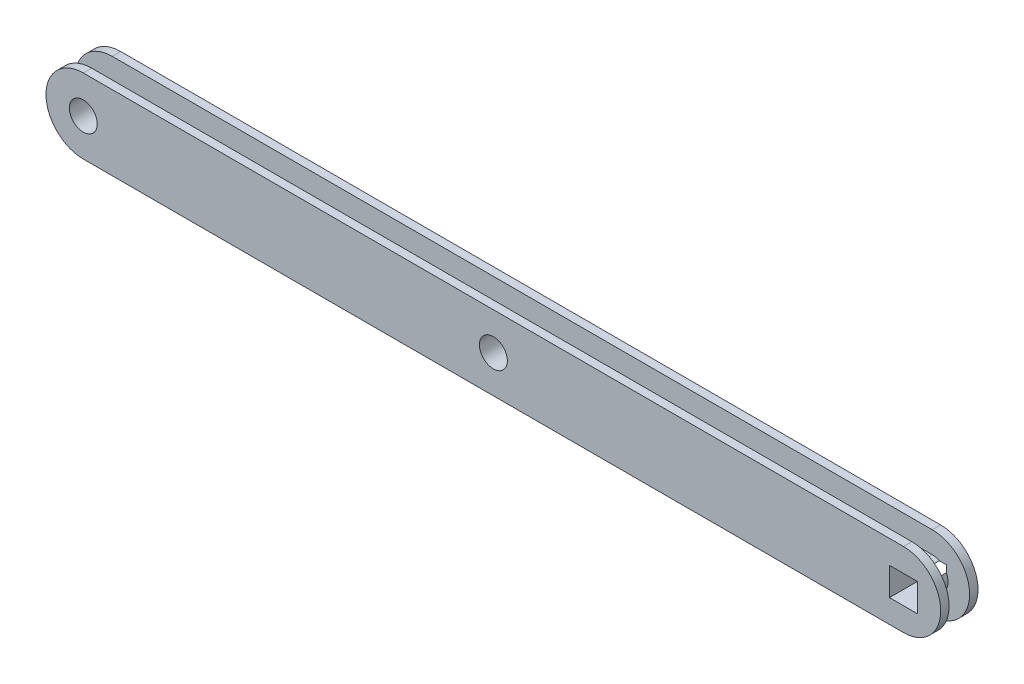
ISO-10303-21;
HEADER;
FILE_DESCRIPTION(('STEP AP214'),'2;1');
FILE_NAME('part.step','',(''),(''),'','','');
FILE_SCHEMA(('AUTOMOTIVE_DESIGN { 1 0 10303 214 1 1 1 1 }'));
ENDSEC;
DATA;
#1=APPLICATION_CONTEXT('core data for automotive mechanical design processes');
#2=APPLICATION_PROTOCOL_DEFINITION('international standard','automotive_design',2000,#1);
#3=PRODUCT_CONTEXT('',#1,'mechanical');
#4=PRODUCT('Part','Part','',(#3));
#5=PRODUCT_RELATED_PRODUCT_CATEGORY('part','',(#4));
#6=PRODUCT_DEFINITION_FORMATION('','',#4);
#7=PRODUCT_DEFINITION_CONTEXT('part definition',#1,'design');
#8=PRODUCT_DEFINITION('design','',#6,#7);
#9=PRODUCT_DEFINITION_SHAPE('','',#8);
#10=(LENGTH_UNIT() NAMED_UNIT(*) SI_UNIT(.MILLI.,.METRE.));
#11=(NAMED_UNIT(*) PLANE_ANGLE_UNIT() SI_UNIT($,.RADIAN.));
#12=(NAMED_UNIT(*) SI_UNIT($,.STERADIAN.) SOLID_ANGLE_UNIT());
#13=UNCERTAINTY_MEASURE_WITH_UNIT(LENGTH_MEASURE(1.E-05),#10,'distance_accuracy_value','');
#14=(GEOMETRIC_REPRESENTATION_CONTEXT(3) GLOBAL_UNCERTAINTY_ASSIGNED_CONTEXT((#13)) GLOBAL_UNIT_ASSIGNED_CONTEXT((#10,
#11,#12)) REPRESENTATION_CONTEXT('',''));
#15=CARTESIAN_POINT('',(0.,0.,0.));
#16=DIRECTION('',(0.,0.,1.));
#17=DIRECTION('',(1.,0.,0.));
#18=AXIS2_PLACEMENT_3D('',#15,#16,#17);
#19=CARTESIAN_POINT('',(0.,0.,-6.35));
#20=DIRECTION('',(0.,-1.,0.));
#21=DIRECTION('',(1.,0.,0.));
#22=AXIS2_PLACEMENT_3D('',#19,#20,#21);
#23=PLANE('',#22);
#24=DIRECTION('',(0.,0.,1.));
#25=VECTOR('',#24,1.);
#26=CARTESIAN_POINT('',(-146.05,0.,-6.35));
#27=LINE('',#26,#25);
#28=CARTESIAN_POINT('',(-146.05,0.,-1.427499939));
#29=VERTEX_POINT('',#28);
#30=CARTESIAN_POINT('',(-146.05,0.,0.));
#31=VERTEX_POINT('',#30);
#32=EDGE_CURVE('E320',#29,#31,#27,.T.);
#33=ORIENTED_EDGE('',*,*,#32,.F.);
#34=DIRECTION('',(1.,0.,0.));
#35=VECTOR('',#34,1.);
#36=CARTESIAN_POINT('',(-152.4,0.,-1.427499939));
#37=LINE('',#36,#35);
#38=CARTESIAN_POINT('',(-6.35000000000005,0.,-1.427499939));
#39=VERTEX_POINT('',#38);
#40=EDGE_CURVE('E304',#29,#39,#37,.T.);
#41=ORIENTED_EDGE('',*,*,#40,.T.);
#42=DIRECTION('',(0.,0.,1.));
#43=VECTOR('',#42,1.);
#44=CARTESIAN_POINT('',(-6.34999999999999,0.,-6.35));
#45=LINE('',#44,#43);
#46=CARTESIAN_POINT('',(-6.34999999999999,0.,0.));
#47=VERTEX_POINT('',#46);
#48=EDGE_CURVE('E446',#39,#47,#45,.T.);
#49=ORIENTED_EDGE('',*,*,#48,.T.);
#50=DIRECTION('',(1.,0.,0.));
#51=VECTOR('',#50,1.);
#52=CARTESIAN_POINT('',(0.,0.,0.));
#53=LINE('',#52,#51);
#54=EDGE_CURVE('E386',#31,#47,#53,.T.);
#55=ORIENTED_EDGE('',*,*,#54,.F.);
#56=EDGE_LOOP('',(#33,#41,#49,#55));
#57=FACE_BOUND('',#56,.T.);
#58=ADVANCED_FACE('F143',(#57),#23,.T.);
#59=CARTESIAN_POINT('',(-6.34999999999999,0.,-6.35));
#60=VERTEX_POINT('',#59);
#61=CARTESIAN_POINT('',(-6.35000000000005,0.,-4.922500061));
#62=VERTEX_POINT('',#61);
#63=EDGE_CURVE('E300',#60,#62,#45,.T.);
#64=ORIENTED_EDGE('',*,*,#63,.T.);
#65=DIRECTION('',(1.,0.,0.));
#66=VECTOR('',#65,1.);
#67=CARTESIAN_POINT('',(-152.4,0.,-4.922500061));
#68=LINE('',#67,#66);
#69=CARTESIAN_POINT('',(-146.05,0.,-4.922500061));
#70=VERTEX_POINT('',#69);
#71=EDGE_CURVE('E292',#70,#62,#68,.T.);
#72=ORIENTED_EDGE('',*,*,#71,.F.);
#73=CARTESIAN_POINT('',(-146.05,0.,-6.35));
#74=VERTEX_POINT('',#73);
#75=EDGE_CURVE('E297',#74,#70,#27,.T.);
#76=ORIENTED_EDGE('',*,*,#75,.F.);
#77=DIRECTION('',(1.,0.,0.));
#78=VECTOR('',#77,1.);
#79=CARTESIAN_POINT('',(0.,0.,-6.35));
#80=LINE('',#79,#78);
#81=EDGE_CURVE('E385',#74,#60,#80,.T.);
#82=ORIENTED_EDGE('',*,*,#81,.T.);
#83=EDGE_LOOP('',(#64,#72,#76,#82));
#84=FACE_BOUND('',#83,.T.);
#85=ADVANCED_FACE('F294',(#84),#23,.T.);
#86=CARTESIAN_POINT('',(-152.4,12.7,-6.35));
#87=DIRECTION('',(0.,1.,0.));
#88=DIRECTION('',(-1.,0.,0.));
#89=AXIS2_PLACEMENT_3D('',#86,#87,#88);
#90=PLANE('',#89);
#91=DIRECTION('',(1.,0.,0.));
#92=VECTOR('',#91,1.);
#93=CARTESIAN_POINT('',(-152.4,12.7,-1.427499939));
#94=LINE('',#93,#92);
#95=CARTESIAN_POINT('',(-146.05,12.7,-1.427499939));
#96=VERTEX_POINT('',#95);
#97=CARTESIAN_POINT('',(-6.35000000000008,12.7,-1.427499939));
#98=VERTEX_POINT('',#97);
#99=EDGE_CURVE('E468',#96,#98,#94,.T.);
#100=ORIENTED_EDGE('',*,*,#99,.F.);
#101=DIRECTION('',(0.,0.,1.));
#102=VECTOR('',#101,1.);
#103=CARTESIAN_POINT('',(-146.05,12.7,-6.35));
#104=LINE('',#103,#102);
#105=CARTESIAN_POINT('',(-146.05,12.7,0.));
#106=VERTEX_POINT('',#105);
#107=EDGE_CURVE('E444',#96,#106,#104,.T.);
#108=ORIENTED_EDGE('',*,*,#107,.T.);
#109=DIRECTION('',(-1.,0.,0.));
#110=VECTOR('',#109,1.);
#111=CARTESIAN_POINT('',(-152.4,12.7,0.));
#112=LINE('',#111,#110);
#113=CARTESIAN_POINT('',(-6.35,12.7,0.));
#114=VERTEX_POINT('',#113);
#115=EDGE_CURVE('E367',#114,#106,#112,.T.);
#116=ORIENTED_EDGE('',*,*,#115,.F.);
#117=DIRECTION('',(0.,0.,1.));
#118=VECTOR('',#117,1.);
#119=CARTESIAN_POINT('',(-6.35,12.7,-6.35));
#120=LINE('',#119,#118);
#121=EDGE_CURVE('E378',#98,#114,#120,.T.);
#122=ORIENTED_EDGE('',*,*,#121,.F.);
#123=EDGE_LOOP('',(#100,#108,#116,#122));
#124=FACE_BOUND('',#123,.T.);
#125=ADVANCED_FACE('F467',(#124),#90,.T.);
#126=CARTESIAN_POINT('',(-6.35,6.34999999999998,-6.35));
#127=DIRECTION('',(0.,0.,1.));
#128=DIRECTION('',(1.,0.,0.));
#129=AXIS2_PLACEMENT_3D('',#126,#127,#128);
#130=CYLINDRICAL_SURFACE('',#129,6.35);
#131=CARTESIAN_POINT('',(-6.35,6.34999999999998,-4.922500061));
#132=DIRECTION('',(0.,0.,1.));
#133=DIRECTION('',(1.,0.,0.));
#134=AXIS2_PLACEMENT_3D('',#131,#132,#133);
#135=CIRCLE('',#134,6.35);
#136=CARTESIAN_POINT('',(-6.35000000000008,12.7,-4.922500061));
#137=VERTEX_POINT('',#136);
#138=EDGE_CURVE('E427',#62,#137,#135,.T.);
#139=ORIENTED_EDGE('',*,*,#138,.F.);
#140=ORIENTED_EDGE('',*,*,#63,.F.);
#141=CARTESIAN_POINT('',(-6.35,6.34999999999998,-6.35));
#142=DIRECTION('',(0.,0.,1.));
#143=DIRECTION('',(1.,0.,0.));
#144=AXIS2_PLACEMENT_3D('',#141,#142,#143);
#145=CIRCLE('',#144,6.35);
#146=CARTESIAN_POINT('',(-6.35,12.7,-6.35));
#147=VERTEX_POINT('',#146);
#148=EDGE_CURVE('E323',#147,#60,#145,.F.);
#149=ORIENTED_EDGE('',*,*,#148,.F.);
#150=EDGE_CURVE('E377',#147,#137,#120,.T.);
#151=ORIENTED_EDGE('',*,*,#150,.T.);
#152=EDGE_LOOP('',(#139,#140,#149,#151));
#153=FACE_BOUND('',#152,.T.);
#154=ADVANCED_FACE('F558',(#153),#130,.T.);
#155=CARTESIAN_POINT('',(-6.35,6.34999999999998,-1.427499939));
#156=DIRECTION('',(0.,0.,-1.));
#157=DIRECTION('',(-1.,0.,0.));
#158=AXIS2_PLACEMENT_3D('',#155,#156,#157);
#159=CIRCLE('',#158,6.35);
#160=EDGE_CURVE('E424',#98,#39,#159,.T.);
#161=ORIENTED_EDGE('',*,*,#160,.F.);
#162=ORIENTED_EDGE('',*,*,#121,.T.);
#163=CARTESIAN_POINT('',(-6.35,6.34999999999998,0.));
#164=DIRECTION('',(0.,0.,1.));
#165=DIRECTION('',(1.,0.,0.));
#166=AXIS2_PLACEMENT_3D('',#163,#164,#165);
#167=CIRCLE('',#166,6.35);
#168=EDGE_CURVE('E319',#114,#47,#167,.F.);
#169=ORIENTED_EDGE('',*,*,#168,.T.);
#170=ORIENTED_EDGE('',*,*,#48,.F.);
#171=EDGE_LOOP('',(#161,#162,#169,#170));
#172=FACE_BOUND('',#171,.T.);
#173=ADVANCED_FACE('F464',(#172),#130,.T.);
#174=CARTESIAN_POINT('',(0.,3.96874999999998,-6.35));
#175=DIRECTION('',(0.,-1.,0.));
#176=DIRECTION('',(0.,0.,-1.));
#177=AXIS2_PLACEMENT_3D('',#174,#175,#176);
#178=PLANE('',#177);
#179=DIRECTION('',(-1.,0.,0.));
#180=VECTOR('',#179,1.);
#181=CARTESIAN_POINT('',(0.,3.96874999999998,-4.922500061));
#182=LINE('',#181,#180);
#183=CARTESIAN_POINT('',(-3.96875,3.96874999999998,-4.922500061));
#184=VERTEX_POINT('',#183);
#185=CARTESIAN_POINT('',(-5.14894319971949,3.96874999999998,-4.922500061));
#186=VERTEX_POINT('',#185);
#187=EDGE_CURVE('E416',#184,#186,#182,.T.);
#188=ORIENTED_EDGE('',*,*,#187,.F.);
#189=DIRECTION('',(0.,0.,1.));
#190=VECTOR('',#189,1.);
#191=CARTESIAN_POINT('',(-3.96875,3.96874999999998,-6.35));
#192=LINE('',#191,#190);
#193=CARTESIAN_POINT('',(-3.96875,3.96874999999998,-6.35));
#194=VERTEX_POINT('',#193);
#195=EDGE_CURVE('E361',#194,#184,#192,.T.);
#196=ORIENTED_EDGE('',*,*,#195,.F.);
#197=DIRECTION('',(1.,0.,0.));
#198=VECTOR('',#197,1.);
#199=CARTESIAN_POINT('',(0.,3.96874999999998,-6.35));
#200=LINE('',#199,#198);
#201=CARTESIAN_POINT('',(-8.73125,3.96874999999998,-6.35));
#202=VERTEX_POINT('',#201);
#203=EDGE_CURVE('E329',#202,#194,#200,.T.);
#204=ORIENTED_EDGE('',*,*,#203,.F.);
#205=DIRECTION('',(0.,0.,1.));
#206=VECTOR('',#205,1.);
#207=CARTESIAN_POINT('',(-8.73125,3.96874999999998,-6.35));
#208=LINE('',#207,#206);
#209=CARTESIAN_POINT('',(-8.73125,3.96874999999998,0.));
#210=VERTEX_POINT('',#209);
#211=EDGE_CURVE('E353',#202,#210,#208,.T.);
#212=ORIENTED_EDGE('',*,*,#211,.T.);
#213=DIRECTION('',(1.,0.,0.));
#214=VECTOR('',#213,1.);
#215=CARTESIAN_POINT('',(0.,3.96874999999998,0.));
#216=LINE('',#215,#214);
#217=CARTESIAN_POINT('',(-3.96875,3.96874999999998,0.));
#218=VERTEX_POINT('',#217);
#219=EDGE_CURVE('E342',#210,#218,#216,.T.);
#220=ORIENTED_EDGE('',*,*,#219,.T.);
#221=CARTESIAN_POINT('',(-3.96875,3.96874999999998,-1.427499939));
#222=VERTEX_POINT('',#221);
#223=EDGE_CURVE('E341',#222,#218,#192,.T.);
#224=ORIENTED_EDGE('',*,*,#223,.F.);
#225=DIRECTION('',(1.,0.,0.));
#226=VECTOR('',#225,1.);
#227=CARTESIAN_POINT('',(0.,3.96874999999998,-1.427499939));
#228=LINE('',#227,#226);
#229=CARTESIAN_POINT('',(-5.14894319971949,3.96874999999998,-1.427499939));
#230=VERTEX_POINT('',#229);
#231=EDGE_CURVE('E407',#230,#222,#228,.T.);
#232=ORIENTED_EDGE('',*,*,#231,.F.);
#233=DIRECTION('',(0.,0.,-1.));
#234=VECTOR('',#233,1.);
#235=CARTESIAN_POINT('',(-5.14894319971949,3.96874999999998,-6.35));
#236=LINE('',#235,#234);
#237=EDGE_CURVE('E422',#186,#230,#236,.F.);
#238=ORIENTED_EDGE('',*,*,#237,.F.);
#239=EDGE_LOOP('',(#188,#196,#204,#212,#220,#224,#232,#238));
#240=FACE_BOUND('',#239,.T.);
#241=ADVANCED_FACE('F420',(#240),#178,.F.);
#242=CARTESIAN_POINT('',(0.,8.73124999999998,-6.35));
#243=DIRECTION('',(0.,-1.,0.));
#244=DIRECTION('',(0.,0.,-1.));
#245=AXIS2_PLACEMENT_3D('',#242,#243,#244);
#246=PLANE('',#245);
#247=DIRECTION('',(0.,0.,1.));
#248=VECTOR('',#247,1.);
#249=CARTESIAN_POINT('',(-3.96875,8.73124999999998,-6.35));
#250=LINE('',#249,#248);
#251=CARTESIAN_POINT('',(-3.96875,8.73124999999998,-6.35));
#252=VERTEX_POINT('',#251);
#253=CARTESIAN_POINT('',(-3.96875,8.73124999999998,-4.922500061));
#254=VERTEX_POINT('',#253);
#255=EDGE_CURVE('E357',#252,#254,#250,.T.);
#256=ORIENTED_EDGE('',*,*,#255,.T.);
#257=DIRECTION('',(-1.,0.,0.));
#258=VECTOR('',#257,1.);
#259=CARTESIAN_POINT('',(0.,8.73124999999998,-4.922500061));
#260=LINE('',#259,#258);
#261=CARTESIAN_POINT('',(-5.14894319971947,8.73124999999998,-4.922500061));
#262=VERTEX_POINT('',#261);
#263=EDGE_CURVE('E423',#254,#262,#260,.T.);
#264=ORIENTED_EDGE('',*,*,#263,.T.);
#265=DIRECTION('',(0.,0.,-1.));
#266=VECTOR('',#265,1.);
#267=CARTESIAN_POINT('',(-5.14894319971947,8.73124999999998,-6.35));
#268=LINE('',#267,#266);
#269=CARTESIAN_POINT('',(-5.14894319971947,8.73124999999998,-1.427499939));
#270=VERTEX_POINT('',#269);
#271=EDGE_CURVE('E493',#262,#270,#268,.F.);
#272=ORIENTED_EDGE('',*,*,#271,.T.);
#273=DIRECTION('',(1.,0.,0.));
#274=VECTOR('',#273,1.);
#275=CARTESIAN_POINT('',(0.,8.73124999999998,-1.427499939));
#276=LINE('',#275,#274);
#277=CARTESIAN_POINT('',(-3.96875,8.73124999999998,-1.427499939));
#278=VERTEX_POINT('',#277);
#279=EDGE_CURVE('E497',#270,#278,#276,.T.);
#280=ORIENTED_EDGE('',*,*,#279,.T.);
#281=CARTESIAN_POINT('',(-3.96875,8.73124999999998,0.));
#282=VERTEX_POINT('',#281);
#283=EDGE_CURVE('E360',#278,#282,#250,.T.);
#284=ORIENTED_EDGE('',*,*,#283,.T.);
#285=DIRECTION('',(1.,0.,0.));
#286=VECTOR('',#285,1.);
#287=CARTESIAN_POINT('',(0.,8.73124999999998,0.));
#288=LINE('',#287,#286);
#289=CARTESIAN_POINT('',(-8.73125,8.73124999999998,0.));
#290=VERTEX_POINT('',#289);
#291=EDGE_CURVE('E348',#290,#282,#288,.T.);
#292=ORIENTED_EDGE('',*,*,#291,.F.);
#293=DIRECTION('',(0.,0.,1.));
#294=VECTOR('',#293,1.);
#295=CARTESIAN_POINT('',(-8.73125,8.73124999999998,-6.35));
#296=LINE('',#295,#294);
#297=CARTESIAN_POINT('',(-8.73125,8.73124999999998,-6.35));
#298=VERTEX_POINT('',#297);
#299=EDGE_CURVE('E355',#298,#290,#296,.T.);
#300=ORIENTED_EDGE('',*,*,#299,.F.);
#301=DIRECTION('',(1.,0.,0.));
#302=VECTOR('',#301,1.);
#303=CARTESIAN_POINT('',(0.,8.73124999999998,-6.35));
#304=LINE('',#303,#302);
#305=EDGE_CURVE('E336',#298,#252,#304,.T.);
#306=ORIENTED_EDGE('',*,*,#305,.T.);
#307=EDGE_LOOP('',(#256,#264,#272,#280,#284,#292,#300,#306));
#308=FACE_BOUND('',#307,.T.);
#309=ADVANCED_FACE('F501',(#308),#246,.T.);
#310=CARTESIAN_POINT('',(-3.96875,0.,-6.35));
#311=DIRECTION('',(1.,0.,0.));
#312=DIRECTION('',(0.,0.,-1.));
#313=AXIS2_PLACEMENT_3D('',#310,#311,#312);
#314=PLANE('',#313);
#315=DIRECTION('',(0.,-1.,0.));
#316=VECTOR('',#315,1.);
#317=CARTESIAN_POINT('',(-3.96875,0.,-4.922500061));
#318=LINE('',#317,#316);
#319=CARTESIAN_POINT('',(-3.96875,5.14894319971946,-4.922500061));
#320=VERTEX_POINT('',#319);
#321=EDGE_CURVE('E12',#320,#184,#318,.T.);
#322=ORIENTED_EDGE('',*,*,#321,.F.);
#323=DIRECTION('',(0.,0.,-1.));
#324=VECTOR('',#323,1.);
#325=CARTESIAN_POINT('',(-3.96875,5.14894319971946,-6.35));
#326=LINE('',#325,#324);
#327=CARTESIAN_POINT('',(-3.96875,5.14894319971946,-1.427499939));
#328=VERTEX_POINT('',#327);
#329=EDGE_CURVE('E147',#328,#320,#326,.T.);
#330=ORIENTED_EDGE('',*,*,#329,.F.);
#331=DIRECTION('',(0.,1.,0.));
#332=VECTOR('',#331,1.);
#333=CARTESIAN_POINT('',(-3.96875,0.,-1.427499939));
#334=LINE('',#333,#332);
#335=EDGE_CURVE('E152',#222,#328,#334,.T.);
#336=ORIENTED_EDGE('',*,*,#335,.F.);
#337=ORIENTED_EDGE('',*,*,#223,.T.);
#338=DIRECTION('',(0.,1.,0.));
#339=VECTOR('',#338,1.);
#340=CARTESIAN_POINT('',(-3.96875,0.,0.));
#341=LINE('',#340,#339);
#342=EDGE_CURVE('E345',#218,#282,#341,.T.);
#343=ORIENTED_EDGE('',*,*,#342,.T.);
#344=ORIENTED_EDGE('',*,*,#283,.F.);
#345=CARTESIAN_POINT('',(-3.96875,7.55105680028051,-1.427499939));
#346=VERTEX_POINT('',#345);
#347=EDGE_CURVE('E394',#346,#278,#334,.T.);
#348=ORIENTED_EDGE('',*,*,#347,.F.);
#349=DIRECTION('',(0.,0.,-1.));
#350=VECTOR('',#349,1.);
#351=CARTESIAN_POINT('',(-3.96875,7.55105680028051,-6.35));
#352=LINE('',#351,#350);
#353=CARTESIAN_POINT('',(-3.96875,7.55105680028051,-4.922500061));
#354=VERTEX_POINT('',#353);
#355=EDGE_CURVE('E314',#354,#346,#352,.F.);
#356=ORIENTED_EDGE('',*,*,#355,.F.);
#357=EDGE_CURVE('E153',#254,#354,#318,.T.);
#358=ORIENTED_EDGE('',*,*,#357,.F.);
#359=ORIENTED_EDGE('',*,*,#255,.F.);
#360=DIRECTION('',(0.,1.,0.));
#361=VECTOR('',#360,1.);
#362=CARTESIAN_POINT('',(-3.96875,0.,-6.35));
#363=LINE('',#362,#361);
#364=EDGE_CURVE('E332',#194,#252,#363,.T.);
#365=ORIENTED_EDGE('',*,*,#364,.F.);
#366=ORIENTED_EDGE('',*,*,#195,.T.);
#367=EDGE_LOOP('',(#322,#330,#336,#337,#343,#344,#348,#356,#358,#359,#365,#366));
#368=FACE_BOUND('',#367,.T.);
#369=ADVANCED_FACE('F411',(#368),#314,.F.);
#370=CARTESIAN_POINT('',(-146.05,6.34999999999998,-6.35));
#371=DIRECTION('',(0.,0.,1.));
#372=DIRECTION('',(1.,0.,0.));
#373=AXIS2_PLACEMENT_3D('',#370,#371,#372);
#374=CYLINDRICAL_SURFACE('',#373,6.35);
#375=ORIENTED_EDGE('',*,*,#75,.T.);
#376=CARTESIAN_POINT('',(-146.05,6.34999999999998,-4.922500061));
#377=DIRECTION('',(0.,0.,1.));
#378=DIRECTION('',(1.,0.,0.));
#379=AXIS2_PLACEMENT_3D('',#376,#377,#378);
#380=CIRCLE('',#379,6.35);
#381=CARTESIAN_POINT('',(-146.05,12.7,-4.922500061));
#382=VERTEX_POINT('',#381);
#383=EDGE_CURVE('E307',#70,#382,#380,.F.);
#384=ORIENTED_EDGE('',*,*,#383,.T.);
#385=CARTESIAN_POINT('',(-146.05,12.7,-6.35));
#386=VERTEX_POINT('',#385);
#387=EDGE_CURVE('E447',#386,#382,#104,.T.);
#388=ORIENTED_EDGE('',*,*,#387,.F.);
#389=CARTESIAN_POINT('',(-146.05,6.34999999999998,-6.35));
#390=DIRECTION('',(0.,0.,1.));
#391=DIRECTION('',(1.,0.,0.));
#392=AXIS2_PLACEMENT_3D('',#389,#390,#391);
#393=CIRCLE('',#392,6.35);
#394=EDGE_CURVE('E318',#386,#74,#393,.T.);
#395=ORIENTED_EDGE('',*,*,#394,.T.);
#396=EDGE_LOOP('',(#375,#384,#388,#395));
#397=FACE_BOUND('',#396,.T.);
#398=ADVANCED_FACE('F317',(#397),#374,.T.);
#399=ORIENTED_EDGE('',*,*,#107,.F.);
#400=CARTESIAN_POINT('',(-146.05,6.34999999999998,-1.427499939));
#401=DIRECTION('',(0.,0.,-1.));
#402=DIRECTION('',(-1.,0.,0.));
#403=AXIS2_PLACEMENT_3D('',#400,#401,#402);
#404=CIRCLE('',#403,6.35);
#405=EDGE_CURVE('E315',#96,#29,#404,.F.);
#406=ORIENTED_EDGE('',*,*,#405,.T.);
#407=ORIENTED_EDGE('',*,*,#32,.T.);
#408=CARTESIAN_POINT('',(-146.05,6.34999999999998,0.));
#409=DIRECTION('',(0.,0.,1.));
#410=DIRECTION('',(1.,0.,0.));
#411=AXIS2_PLACEMENT_3D('',#408,#409,#410);
#412=CIRCLE('',#411,6.35);
#413=EDGE_CURVE('E327',#106,#31,#412,.T.);
#414=ORIENTED_EDGE('',*,*,#413,.F.);
#415=EDGE_LOOP('',(#399,#406,#407,#414));
#416=FACE_BOUND('',#415,.T.);
#417=ADVANCED_FACE('F470',(#416),#374,.T.);
#418=DIRECTION('',(1.,0.,0.));
#419=VECTOR('',#418,1.);
#420=CARTESIAN_POINT('',(-152.4,12.7,-4.922500061));
#421=LINE('',#420,#419);
#422=EDGE_CURVE('E310',#382,#137,#421,.T.);
#423=ORIENTED_EDGE('',*,*,#422,.T.);
#424=ORIENTED_EDGE('',*,*,#150,.F.);
#425=DIRECTION('',(-1.,0.,0.));
#426=VECTOR('',#425,1.);
#427=CARTESIAN_POINT('',(-152.4,12.7,-6.35));
#428=LINE('',#427,#426);
#429=EDGE_CURVE('E382',#147,#386,#428,.T.);
#430=ORIENTED_EDGE('',*,*,#429,.T.);
#431=ORIENTED_EDGE('',*,*,#387,.T.);
#432=EDGE_LOOP('',(#423,#424,#430,#431));
#433=FACE_BOUND('',#432,.T.);
#434=ADVANCED_FACE('F145',(#433),#90,.T.);
#435=CARTESIAN_POINT('',(0.,0.,-6.35));
#436=DIRECTION('',(0.,0.,-1.));
#437=DIRECTION('',(-1.,0.,0.));
#438=AXIS2_PLACEMENT_3D('',#435,#436,#437);
#439=PLANE('',#438);
#440=ORIENTED_EDGE('',*,*,#148,.T.);
#441=ORIENTED_EDGE('',*,*,#81,.F.);
#442=ORIENTED_EDGE('',*,*,#394,.F.);
#443=ORIENTED_EDGE('',*,*,#429,.F.);
#444=EDGE_LOOP('',(#440,#441,#442,#443));
#445=FACE_BOUND('',#444,.T.);
#446=ORIENTED_EDGE('',*,*,#203,.T.);
#447=ORIENTED_EDGE('',*,*,#364,.T.);
#448=ORIENTED_EDGE('',*,*,#305,.F.);
#449=DIRECTION('',(0.,1.,0.));
#450=VECTOR('',#449,1.);
#451=CARTESIAN_POINT('',(-8.73125,0.,-6.35));
#452=LINE('',#451,#450);
#453=EDGE_CURVE('E339',#202,#298,#452,.T.);
#454=ORIENTED_EDGE('',*,*,#453,.F.);
#455=EDGE_LOOP('',(#446,#447,#448,#454));
#456=FACE_BOUND('',#455,.T.);
#457=CARTESIAN_POINT('',(-76.2,6.34999999999998,-6.35));
#458=DIRECTION('',(0.,0.,1.));
#459=DIRECTION('',(1.,0.,0.));
#460=AXIS2_PLACEMENT_3D('',#457,#458,#459);
#461=CIRCLE('',#460,2.38125000000001);
#462=CARTESIAN_POINT('',(-73.81875,6.34999999999998,-6.35));
#463=VERTEX_POINT('',#462);
#464=EDGE_CURVE('E371',#463,#463,#461,.T.);
#465=ORIENTED_EDGE('',*,*,#464,.T.);
#466=EDGE_LOOP('',(#465));
#467=FACE_BOUND('',#466,.T.);
#468=CARTESIAN_POINT('',(-146.05,6.34999999999998,-6.35));
#469=DIRECTION('',(0.,0.,1.));
#470=DIRECTION('',(1.,0.,0.));
#471=AXIS2_PLACEMENT_3D('',#468,#469,#470);
#472=CIRCLE('',#471,2.38125000000001);
#473=CARTESIAN_POINT('',(-143.66875,6.34999999999998,-6.35));
#474=VERTEX_POINT('',#473);
#475=EDGE_CURVE('E364',#474,#474,#472,.T.);
#476=ORIENTED_EDGE('',*,*,#475,.T.);
#477=EDGE_LOOP('',(#476));
#478=FACE_BOUND('',#477,.T.);
#479=ADVANCED_FACE('F514',(#445,#456,#467,#478),#439,.T.);
#480=CARTESIAN_POINT('',(0.,0.,0.));
#481=DIRECTION('',(0.,0.,-1.));
#482=DIRECTION('',(-1.,0.,0.));
#483=AXIS2_PLACEMENT_3D('',#480,#481,#482);
#484=PLANE('',#483);
#485=CARTESIAN_POINT('',(-76.2,6.34999999999998,0.));
#486=DIRECTION('',(0.,0.,1.));
#487=DIRECTION('',(1.,0.,0.));
#488=AXIS2_PLACEMENT_3D('',#485,#486,#487);
#489=CIRCLE('',#488,2.38125000000001);
#490=CARTESIAN_POINT('',(-73.81875,6.34999999999998,0.));
#491=VERTEX_POINT('',#490);
#492=EDGE_CURVE('E374',#491,#491,#489,.T.);
#493=ORIENTED_EDGE('',*,*,#492,.F.);
#494=EDGE_LOOP('',(#493));
#495=FACE_BOUND('',#494,.T.);
#496=CARTESIAN_POINT('',(-146.05,6.34999999999998,0.));
#497=DIRECTION('',(0.,0.,1.));
#498=DIRECTION('',(1.,0.,0.));
#499=AXIS2_PLACEMENT_3D('',#496,#497,#498);
#500=CIRCLE('',#499,2.38125000000001);
#501=CARTESIAN_POINT('',(-143.66875,6.34999999999998,0.));
#502=VERTEX_POINT('',#501);
#503=EDGE_CURVE('E368',#502,#502,#500,.T.);
#504=ORIENTED_EDGE('',*,*,#503,.F.);
#505=EDGE_LOOP('',(#504));
#506=FACE_BOUND('',#505,.T.);
#507=ORIENTED_EDGE('',*,*,#342,.F.);
#508=ORIENTED_EDGE('',*,*,#219,.F.);
#509=DIRECTION('',(0.,1.,0.));
#510=VECTOR('',#509,1.);
#511=CARTESIAN_POINT('',(-8.73125,0.,0.));
#512=LINE('',#511,#510);
#513=EDGE_CURVE('E333',#210,#290,#512,.T.);
#514=ORIENTED_EDGE('',*,*,#513,.T.);
#515=ORIENTED_EDGE('',*,*,#291,.T.);
#516=EDGE_LOOP('',(#507,#508,#514,#515));
#517=FACE_BOUND('',#516,.T.);
#518=ORIENTED_EDGE('',*,*,#54,.T.);
#519=ORIENTED_EDGE('',*,*,#168,.F.);
#520=ORIENTED_EDGE('',*,*,#115,.T.);
#521=ORIENTED_EDGE('',*,*,#413,.T.);
#522=EDGE_LOOP('',(#518,#519,#520,#521));
#523=FACE_BOUND('',#522,.T.);
#524=ADVANCED_FACE('F452',(#495,#506,#517,#523),#484,.F.);
#525=CARTESIAN_POINT('',(-146.05,6.34999999999998,-6.35));
#526=DIRECTION('',(0.,0.,1.));
#527=DIRECTION('',(1.,0.,0.));
#528=AXIS2_PLACEMENT_3D('',#525,#526,#527);
#529=CYLINDRICAL_SURFACE('',#528,2.38125000000001);
#530=ORIENTED_EDGE('',*,*,#475,.F.);
#531=EDGE_LOOP('',(#530));
#532=FACE_BOUND('',#531,.T.);
#533=ORIENTED_EDGE('',*,*,#503,.T.);
#534=EDGE_LOOP('',(#533));
#535=FACE_BOUND('',#534,.T.);
#536=ADVANCED_FACE('F553',(#532,#535),#529,.F.);
#537=CARTESIAN_POINT('',(-76.2,6.34999999999998,-6.35));
#538=DIRECTION('',(0.,0.,1.));
#539=DIRECTION('',(1.,0.,0.));
#540=AXIS2_PLACEMENT_3D('',#537,#538,#539);
#541=CYLINDRICAL_SURFACE('',#540,2.38125000000001);
#542=ORIENTED_EDGE('',*,*,#464,.F.);
#543=EDGE_LOOP('',(#542));
#544=FACE_BOUND('',#543,.T.);
#545=ORIENTED_EDGE('',*,*,#492,.T.);
#546=EDGE_LOOP('',(#545));
#547=FACE_BOUND('',#546,.T.);
#548=ADVANCED_FACE('F562',(#544,#547),#541,.F.);
#549=CARTESIAN_POINT('',(-8.73125,0.,-6.35));
#550=DIRECTION('',(1.,0.,0.));
#551=DIRECTION('',(0.,0.,-1.));
#552=AXIS2_PLACEMENT_3D('',#549,#550,#551);
#553=PLANE('',#552);
#554=ORIENTED_EDGE('',*,*,#513,.F.);
#555=ORIENTED_EDGE('',*,*,#211,.F.);
#556=ORIENTED_EDGE('',*,*,#453,.T.);
#557=ORIENTED_EDGE('',*,*,#299,.T.);
#558=EDGE_LOOP('',(#554,#555,#556,#557));
#559=FACE_BOUND('',#558,.T.);
#560=ADVANCED_FACE('F565',(#559),#553,.T.);
#561=CARTESIAN_POINT('',(-146.050000000001,152.4,-4.922500061));
#562=DIRECTION('',(0.,0.,1.));
#563=DIRECTION('',(1.,0.,0.));
#564=AXIS2_PLACEMENT_3D('',#561,#562,#563);
#565=PLANE('',#564);
#566=DIRECTION('',(1.,0.,0.));
#567=VECTOR('',#566,1.);
#568=CARTESIAN_POINT('',(-152.4,3.68299999999997,-4.922500061));
#569=LINE('',#568,#567);
#570=CARTESIAN_POINT('',(-146.05,3.68299999999997,-4.922500061));
#571=VERTEX_POINT('',#570);
#572=CARTESIAN_POINT('',(-6.34999999999999,3.68299999999997,-4.922500061));
#573=VERTEX_POINT('',#572);
#574=EDGE_CURVE('E303',#571,#573,#569,.T.);
#575=ORIENTED_EDGE('',*,*,#574,.F.);
#576=CARTESIAN_POINT('',(-146.05,6.34999999999999,-4.922500061));
#577=DIRECTION('',(0.,0.,-1.));
#578=DIRECTION('',(-1.,0.,0.));
#579=AXIS2_PLACEMENT_3D('',#576,#577,#578);
#580=CIRCLE('',#579,2.66700000000001);
#581=CARTESIAN_POINT('',(-146.05,9.017,-4.922500061));
#582=VERTEX_POINT('',#581);
#583=EDGE_CURVE('E438',#571,#582,#580,.T.);
#584=ORIENTED_EDGE('',*,*,#583,.T.);
#585=DIRECTION('',(1.,0.,0.));
#586=VECTOR('',#585,1.);
#587=CARTESIAN_POINT('',(-152.4,9.017,-4.922500061));
#588=LINE('',#587,#586);
#589=CARTESIAN_POINT('',(-6.35000000000005,9.017,-4.922500061));
#590=VERTEX_POINT('',#589);
#591=EDGE_CURVE('E477',#582,#590,#588,.T.);
#592=ORIENTED_EDGE('',*,*,#591,.T.);
#593=CARTESIAN_POINT('',(-6.34999999999999,6.34999999999999,-4.922500061));
#594=DIRECTION('',(0.,0.,1.));
#595=DIRECTION('',(1.,0.,0.));
#596=AXIS2_PLACEMENT_3D('',#593,#594,#595);
#597=CIRCLE('',#596,2.66700000000001);
#598=EDGE_CURVE('E487',#262,#590,#597,.T.);
#599=ORIENTED_EDGE('',*,*,#598,.F.);
#600=ORIENTED_EDGE('',*,*,#263,.F.);
#601=ORIENTED_EDGE('',*,*,#357,.T.);
#602=EDGE_CURVE('E165',#320,#354,#597,.T.);
#603=ORIENTED_EDGE('',*,*,#602,.F.);
#604=ORIENTED_EDGE('',*,*,#321,.T.);
#605=ORIENTED_EDGE('',*,*,#187,.T.);
#606=EDGE_CURVE('E488',#573,#186,#597,.T.);
#607=ORIENTED_EDGE('',*,*,#606,.F.);
#608=EDGE_LOOP('',(#575,#584,#592,#599,#600,#601,#603,#604,#605,#607));
#609=FACE_BOUND('',#608,.T.);
#610=ORIENTED_EDGE('',*,*,#138,.T.);
#611=ORIENTED_EDGE('',*,*,#422,.F.);
#612=ORIENTED_EDGE('',*,*,#383,.F.);
#613=ORIENTED_EDGE('',*,*,#71,.T.);
#614=EDGE_LOOP('',(#610,#611,#612,#613));
#615=FACE_BOUND('',#614,.T.);
#616=ADVANCED_FACE('F308',(#609,#615),#565,.T.);
#617=CARTESIAN_POINT('',(-146.050000000001,152.4,-1.427499939));
#618=DIRECTION('',(0.,0.,-1.));
#619=DIRECTION('',(-1.,0.,0.));
#620=AXIS2_PLACEMENT_3D('',#617,#618,#619);
#621=PLANE('',#620);
#622=DIRECTION('',(1.,0.,0.));
#623=VECTOR('',#622,1.);
#624=CARTESIAN_POINT('',(-152.4,3.68299999999997,-1.427499939));
#625=LINE('',#624,#623);
#626=CARTESIAN_POINT('',(-146.05,3.68299999999997,-1.427499939));
#627=VERTEX_POINT('',#626);
#628=CARTESIAN_POINT('',(-6.35000000000005,3.68299999999999,-1.427499939));
#629=VERTEX_POINT('',#628);
#630=EDGE_CURVE('E482',#627,#629,#625,.T.);
#631=ORIENTED_EDGE('',*,*,#630,.T.);
#632=CARTESIAN_POINT('',(-6.34999999999999,6.34999999999999,-1.427499939));
#633=DIRECTION('',(0.,0.,1.));
#634=DIRECTION('',(1.,0.,0.));
#635=AXIS2_PLACEMENT_3D('',#632,#633,#634);
#636=CIRCLE('',#635,2.66700000000001);
#637=EDGE_CURVE('E491',#629,#230,#636,.T.);
#638=ORIENTED_EDGE('',*,*,#637,.T.);
#639=ORIENTED_EDGE('',*,*,#231,.T.);
#640=ORIENTED_EDGE('',*,*,#335,.T.);
#641=EDGE_CURVE('E160',#328,#346,#636,.T.);
#642=ORIENTED_EDGE('',*,*,#641,.T.);
#643=ORIENTED_EDGE('',*,*,#347,.T.);
#644=ORIENTED_EDGE('',*,*,#279,.F.);
#645=CARTESIAN_POINT('',(-6.34999999999999,9.017,-1.427499939));
#646=VERTEX_POINT('',#645);
#647=EDGE_CURVE('E490',#270,#646,#636,.T.);
#648=ORIENTED_EDGE('',*,*,#647,.T.);
#649=DIRECTION('',(1.,0.,0.));
#650=VECTOR('',#649,1.);
#651=CARTESIAN_POINT('',(-152.4,9.017,-1.427499939));
#652=LINE('',#651,#650);
#653=CARTESIAN_POINT('',(-146.05,9.017,-1.427499939));
#654=VERTEX_POINT('',#653);
#655=EDGE_CURVE('E480',#654,#646,#652,.T.);
#656=ORIENTED_EDGE('',*,*,#655,.F.);
#657=CARTESIAN_POINT('',(-146.05,6.34999999999999,-1.427499939));
#658=DIRECTION('',(0.,0.,-1.));
#659=DIRECTION('',(-1.,0.,0.));
#660=AXIS2_PLACEMENT_3D('',#657,#658,#659);
#661=CIRCLE('',#660,2.66700000000001);
#662=EDGE_CURVE('E441',#627,#654,#661,.T.);
#663=ORIENTED_EDGE('',*,*,#662,.F.);
#664=EDGE_LOOP('',(#631,#638,#639,#640,#642,#643,#644,#648,#656,#663));
#665=FACE_BOUND('',#664,.T.);
#666=ORIENTED_EDGE('',*,*,#40,.F.);
#667=ORIENTED_EDGE('',*,*,#405,.F.);
#668=ORIENTED_EDGE('',*,*,#99,.T.);
#669=ORIENTED_EDGE('',*,*,#160,.T.);
#670=EDGE_LOOP('',(#666,#667,#668,#669));
#671=FACE_BOUND('',#670,.T.);
#672=ADVANCED_FACE('F402',(#665,#671),#621,.T.);
#673=CARTESIAN_POINT('',(-146.05,6.34999999999999,-6.35));
#674=DIRECTION('',(0.,0.,-1.));
#675=DIRECTION('',(-1.,0.,0.));
#676=AXIS2_PLACEMENT_3D('',#673,#674,#675);
#677=CYLINDRICAL_SURFACE('',#676,2.66700000000001);
#678=ORIENTED_EDGE('',*,*,#583,.F.);
#679=DIRECTION('',(0.,0.,1.));
#680=VECTOR('',#679,1.);
#681=CARTESIAN_POINT('',(-146.05,3.68299999999997,0.));
#682=LINE('',#681,#680);
#683=EDGE_CURVE('E435',#571,#627,#682,.T.);
#684=ORIENTED_EDGE('',*,*,#683,.T.);
#685=ORIENTED_EDGE('',*,*,#662,.T.);
#686=DIRECTION('',(0.,0.,1.));
#687=VECTOR('',#686,1.);
#688=CARTESIAN_POINT('',(-146.05,9.017,0.));
#689=LINE('',#688,#687);
#690=EDGE_CURVE('E433',#582,#654,#689,.T.);
#691=ORIENTED_EDGE('',*,*,#690,.F.);
#692=EDGE_LOOP('',(#678,#684,#685,#691));
#693=FACE_BOUND('',#692,.T.);
#694=ADVANCED_FACE('F526',(#693),#677,.T.);
#695=CARTESIAN_POINT('',(-6.34999999999999,6.34999999999999,-6.35));
#696=DIRECTION('',(0.,0.,-1.));
#697=DIRECTION('',(1.,0.,0.));
#698=AXIS2_PLACEMENT_3D('',#695,#696,#697);
#699=CYLINDRICAL_SURFACE('',#698,2.66700000000001);
#700=ORIENTED_EDGE('',*,*,#237,.T.);
#701=ORIENTED_EDGE('',*,*,#637,.F.);
#702=DIRECTION('',(0.,0.,1.));
#703=VECTOR('',#702,1.);
#704=CARTESIAN_POINT('',(-6.34999999999999,3.68299999999997,0.));
#705=LINE('',#704,#703);
#706=EDGE_CURVE('E485',#573,#629,#705,.T.);
#707=ORIENTED_EDGE('',*,*,#706,.F.);
#708=ORIENTED_EDGE('',*,*,#606,.T.);
#709=EDGE_LOOP('',(#700,#701,#707,#708));
#710=FACE_BOUND('',#709,.T.);
#711=ADVANCED_FACE('F533',(#710),#699,.T.);
#712=ORIENTED_EDGE('',*,*,#329,.T.);
#713=ORIENTED_EDGE('',*,*,#602,.T.);
#714=ORIENTED_EDGE('',*,*,#355,.T.);
#715=ORIENTED_EDGE('',*,*,#641,.F.);
#716=EDGE_LOOP('',(#712,#713,#714,#715));
#717=FACE_BOUND('',#716,.T.);
#718=ADVANCED_FACE('F535',(#717),#699,.T.);
#719=ORIENTED_EDGE('',*,*,#598,.T.);
#720=DIRECTION('',(0.,0.,1.));
#721=VECTOR('',#720,1.);
#722=CARTESIAN_POINT('',(-6.34999999999999,9.017,0.));
#723=LINE('',#722,#721);
#724=EDGE_CURVE('E475',#590,#646,#723,.T.);
#725=ORIENTED_EDGE('',*,*,#724,.T.);
#726=ORIENTED_EDGE('',*,*,#647,.F.);
#727=ORIENTED_EDGE('',*,*,#271,.F.);
#728=EDGE_LOOP('',(#719,#725,#726,#727));
#729=FACE_BOUND('',#728,.T.);
#730=ADVANCED_FACE('F519',(#729),#699,.T.);
#731=CARTESIAN_POINT('',(-152.4,9.017,-1.427499939));
#732=DIRECTION('',(0.,-1.,0.));
#733=DIRECTION('',(0.,0.,-1.));
#734=AXIS2_PLACEMENT_3D('',#731,#732,#733);
#735=PLANE('',#734);
#736=ORIENTED_EDGE('',*,*,#690,.T.);
#737=ORIENTED_EDGE('',*,*,#655,.T.);
#738=ORIENTED_EDGE('',*,*,#724,.F.);
#739=ORIENTED_EDGE('',*,*,#591,.F.);
#740=EDGE_LOOP('',(#736,#737,#738,#739));
#741=FACE_BOUND('',#740,.T.);
#742=ADVANCED_FACE('F545',(#741),#735,.F.);
#743=CARTESIAN_POINT('',(-152.4,3.68299999999997,-1.427499939));
#744=DIRECTION('',(0.,-1.,0.));
#745=DIRECTION('',(1.,0.,0.));
#746=AXIS2_PLACEMENT_3D('',#743,#744,#745);
#747=PLANE('',#746);
#748=ORIENTED_EDGE('',*,*,#574,.T.);
#749=ORIENTED_EDGE('',*,*,#706,.T.);
#750=ORIENTED_EDGE('',*,*,#630,.F.);
#751=ORIENTED_EDGE('',*,*,#683,.F.);
#752=EDGE_LOOP('',(#748,#749,#750,#751));
#753=FACE_BOUND('',#752,.T.);
#754=ADVANCED_FACE('F528',(#753),#747,.T.);
#755=CLOSED_SHELL('',(#58,#85,#125,#154,#173,#241,#309,#369,#398,#417,#434,#479,#524,#536,#548,
#560,#616,#672,#694,#711,#718,#730,#742,#754));
#756=MANIFOLD_SOLID_BREP('B2',#755);
#757=ADVANCED_BREP_SHAPE_REPRESENTATION('',(#18,#756),#14);
#758=SHAPE_DEFINITION_REPRESENTATION(#9,#757);
ENDSEC;
END-ISO-10303-21;
